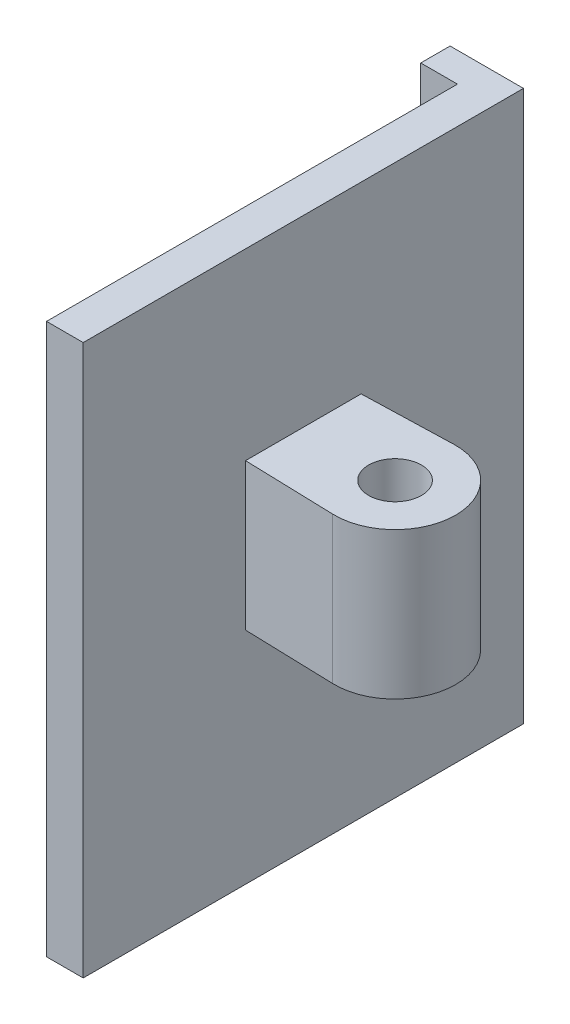
ISO-10303-21;
HEADER;
FILE_DESCRIPTION(('STEP AP214'),'2;1');
FILE_NAME('part.step','',(''),(''),'','','');
FILE_SCHEMA(('AUTOMOTIVE_DESIGN { 1 0 10303 214 1 1 1 1 }'));
ENDSEC;
DATA;
#1=APPLICATION_CONTEXT('core data for automotive mechanical design processes');
#2=APPLICATION_PROTOCOL_DEFINITION('international standard','automotive_design',2000,#1);
#3=PRODUCT_CONTEXT('',#1,'mechanical');
#4=PRODUCT('Part','Part','',(#3));
#5=PRODUCT_RELATED_PRODUCT_CATEGORY('part','',(#4));
#6=PRODUCT_DEFINITION_FORMATION('','',#4);
#7=PRODUCT_DEFINITION_CONTEXT('part definition',#1,'design');
#8=PRODUCT_DEFINITION('design','',#6,#7);
#9=PRODUCT_DEFINITION_SHAPE('','',#8);
#10=(LENGTH_UNIT() NAMED_UNIT(*) SI_UNIT(.MILLI.,.METRE.));
#11=(NAMED_UNIT(*) PLANE_ANGLE_UNIT() SI_UNIT($,.RADIAN.));
#12=(NAMED_UNIT(*) SI_UNIT($,.STERADIAN.) SOLID_ANGLE_UNIT());
#13=UNCERTAINTY_MEASURE_WITH_UNIT(LENGTH_MEASURE(1.E-05),#10,'distance_accuracy_value','');
#14=(GEOMETRIC_REPRESENTATION_CONTEXT(3) GLOBAL_UNCERTAINTY_ASSIGNED_CONTEXT((#13)) GLOBAL_UNIT_ASSIGNED_CONTEXT((#10,
#11,#12)) REPRESENTATION_CONTEXT('',''));
#15=CARTESIAN_POINT('',(0.,0.,0.));
#16=DIRECTION('',(0.,0.,1.));
#17=DIRECTION('',(1.,0.,0.));
#18=AXIS2_PLACEMENT_3D('',#15,#16,#17);
#19=CARTESIAN_POINT('',(2.5,-8.25,0.));
#20=DIRECTION('',(0.,-1.,0.));
#21=DIRECTION('',(0.,0.,-1.));
#22=AXIS2_PLACEMENT_3D('',#19,#20,#21);
#23=CYLINDRICAL_SURFACE('',#22,0.36);
#24=CARTESIAN_POINT('',(2.5,-8.25,0.));
#25=DIRECTION('',(0.,1.,0.));
#26=DIRECTION('',(0.,0.,1.));
#27=AXIS2_PLACEMENT_3D('',#24,#25,#26);
#28=CIRCLE('',#27,0.36);
#29=CARTESIAN_POINT('',(2.5,-8.25,0.360000000000001));
#30=VERTEX_POINT('',#29);
#31=EDGE_CURVE('E184',#30,#30,#28,.T.);
#32=ORIENTED_EDGE('',*,*,#31,.T.);
#33=EDGE_LOOP('',(#32));
#34=FACE_BOUND('',#33,.T.);
#35=CARTESIAN_POINT('',(2.5,-9.65,0.));
#36=DIRECTION('',(0.,-1.,0.));
#37=DIRECTION('',(0.,0.,-1.));
#38=AXIS2_PLACEMENT_3D('',#35,#36,#37);
#39=CIRCLE('',#38,0.36);
#40=CARTESIAN_POINT('',(2.5,-9.65,-0.359999999999999));
#41=VERTEX_POINT('',#40);
#42=EDGE_CURVE('E43',#41,#41,#39,.T.);
#43=ORIENTED_EDGE('',*,*,#42,.T.);
#44=EDGE_LOOP('',(#43));
#45=FACE_BOUND('',#44,.T.);
#46=ADVANCED_FACE('F39',(#34,#45),#23,.F.);
#47=CARTESIAN_POINT('',(0.750000000000001,-8.25,3.));
#48=DIRECTION('',(1.,0.,0.));
#49=DIRECTION('',(0.,0.,-1.));
#50=AXIS2_PLACEMENT_3D('',#47,#48,#49);
#51=PLANE('',#50);
#52=DIRECTION('',(0.,1.,0.));
#53=VECTOR('',#52,1.);
#54=CARTESIAN_POINT('',(0.750000000000001,-5.75,-2.6));
#55=LINE('',#54,#53);
#56=CARTESIAN_POINT('',(0.750000000000001,-13.25,-2.6));
#57=VERTEX_POINT('',#56);
#58=CARTESIAN_POINT('',(0.750000000000001,-5.75,-2.6));
#59=VERTEX_POINT('',#58);
#60=EDGE_CURVE('E55',#57,#59,#55,.T.);
#61=ORIENTED_EDGE('',*,*,#60,.F.);
#62=DIRECTION('',(0.,0.,1.));
#63=VECTOR('',#62,1.);
#64=CARTESIAN_POINT('',(0.750000000000001,-13.25,-3.));
#65=LINE('',#64,#63);
#66=CARTESIAN_POINT('',(0.750000000000001,-13.25,3.));
#67=VERTEX_POINT('',#66);
#68=EDGE_CURVE('E169',#57,#67,#65,.T.);
#69=ORIENTED_EDGE('',*,*,#68,.T.);
#70=DIRECTION('',(0.,-1.,0.));
#71=VECTOR('',#70,1.);
#72=CARTESIAN_POINT('',(0.750000000000001,-8.25,3.));
#73=LINE('',#72,#71);
#74=CARTESIAN_POINT('',(0.750000000000001,-5.75,3.));
#75=VERTEX_POINT('',#74);
#76=EDGE_CURVE('E204',#75,#67,#73,.T.);
#77=ORIENTED_EDGE('',*,*,#76,.F.);
#78=DIRECTION('',(0.,0.,1.));
#79=VECTOR('',#78,1.);
#80=CARTESIAN_POINT('',(0.750000000000001,-5.75,-3.));
#81=LINE('',#80,#79);
#82=EDGE_CURVE('E164',#59,#75,#81,.T.);
#83=ORIENTED_EDGE('',*,*,#82,.F.);
#84=EDGE_LOOP('',(#61,#69,#77,#83));
#85=FACE_BOUND('',#84,.T.);
#86=ADVANCED_FACE('F235',(#85),#51,.F.);
#87=CARTESIAN_POINT('',(2.5,-8.25,0.));
#88=DIRECTION('',(0.,1.,0.));
#89=DIRECTION('',(0.,0.,1.));
#90=AXIS2_PLACEMENT_3D('',#87,#88,#89);
#91=PLANE('',#90);
#92=DIRECTION('',(0.,0.,-1.));
#93=VECTOR('',#92,1.);
#94=CARTESIAN_POINT('',(1.25,-8.25,0.));
#95=LINE('',#94,#93);
#96=CARTESIAN_POINT('',(1.25,-8.25,0.78768744273324));
#97=VERTEX_POINT('',#96);
#98=CARTESIAN_POINT('',(1.25,-8.25,-0.787687442733241));
#99=VERTEX_POINT('',#98);
#100=EDGE_CURVE('E181',#97,#99,#95,.T.);
#101=ORIENTED_EDGE('',*,*,#100,.F.);
#102=DIRECTION('',(0.99954579976556,0.,0.0301362600703332));
#103=VECTOR('',#102,1.);
#104=CARTESIAN_POINT('',(2.47513758544198,-8.25,0.824625284806589));
#105=LINE('',#104,#103);
#106=CARTESIAN_POINT('',(2.47513758544198,-8.25,0.824625284806589));
#107=VERTEX_POINT('',#106);
#108=EDGE_CURVE('E64',#97,#107,#105,.T.);
#109=ORIENTED_EDGE('',*,*,#108,.T.);
#110=CARTESIAN_POINT('',(2.5,-8.25,0.));
#111=DIRECTION('',(0.,1.,0.));
#112=DIRECTION('',(0.,0.,1.));
#113=AXIS2_PLACEMENT_3D('',#110,#111,#112);
#114=CIRCLE('',#113,0.825000000000001);
#115=CARTESIAN_POINT('',(2.47513758544198,-8.25,-0.824625284806588));
#116=VERTEX_POINT('',#115);
#117=EDGE_CURVE('E188',#107,#116,#114,.T.);
#118=ORIENTED_EDGE('',*,*,#117,.T.);
#119=DIRECTION('',(-0.99954579976556,0.,0.0301362600703313));
#120=VECTOR('',#119,1.);
#121=CARTESIAN_POINT('',(1.25,-8.25,-0.787687442733241));
#122=LINE('',#121,#120);
#123=EDGE_CURVE('E86',#116,#99,#122,.T.);
#124=ORIENTED_EDGE('',*,*,#123,.T.);
#125=EDGE_LOOP('',(#101,#109,#118,#124));
#126=FACE_BOUND('',#125,.T.);
#127=ORIENTED_EDGE('',*,*,#31,.F.);
#128=EDGE_LOOP('',(#127));
#129=FACE_BOUND('',#128,.T.);
#130=ADVANCED_FACE('F243',(#126,#129),#91,.T.);
#131=CARTESIAN_POINT('',(2.5,-10.25,0.));
#132=DIRECTION('',(0.,1.,0.));
#133=DIRECTION('',(0.,0.,1.));
#134=AXIS2_PLACEMENT_3D('',#131,#132,#133);
#135=PLANE('',#134);
#136=CARTESIAN_POINT('',(2.5,-10.25,0.));
#137=DIRECTION('',(0.,-1.,0.));
#138=DIRECTION('',(0.,0.,-1.));
#139=AXIS2_PLACEMENT_3D('',#136,#137,#138);
#140=CIRCLE('',#139,0.45);
#141=CARTESIAN_POINT('',(2.5,-10.25,-0.449999999999999));
#142=VERTEX_POINT('',#141);
#143=EDGE_CURVE('E155',#142,#142,#140,.T.);
#144=ORIENTED_EDGE('',*,*,#143,.F.);
#145=EDGE_LOOP('',(#144));
#146=FACE_BOUND('',#145,.T.);
#147=DIRECTION('',(0.99954579976556,0.,0.0301362600703332));
#148=VECTOR('',#147,1.);
#149=CARTESIAN_POINT('',(2.47513758544198,-10.25,0.824625284806589));
#150=LINE('',#149,#148);
#151=CARTESIAN_POINT('',(1.25,-10.25,0.78768744273324));
#152=VERTEX_POINT('',#151);
#153=CARTESIAN_POINT('',(2.47513758544198,-10.25,0.824625284806589));
#154=VERTEX_POINT('',#153);
#155=EDGE_CURVE('E79',#152,#154,#150,.T.);
#156=ORIENTED_EDGE('',*,*,#155,.F.);
#157=DIRECTION('',(0.,0.,-1.));
#158=VECTOR('',#157,1.);
#159=CARTESIAN_POINT('',(1.25,-10.25,0.));
#160=LINE('',#159,#158);
#161=CARTESIAN_POINT('',(1.25,-10.25,-0.787687442733241));
#162=VERTEX_POINT('',#161);
#163=EDGE_CURVE('E179',#152,#162,#160,.T.);
#164=ORIENTED_EDGE('',*,*,#163,.T.);
#165=DIRECTION('',(-0.99954579976556,0.,0.0301362600703313));
#166=VECTOR('',#165,1.);
#167=CARTESIAN_POINT('',(1.25,-10.25,-0.787687442733241));
#168=LINE('',#167,#166);
#169=CARTESIAN_POINT('',(2.47513758544198,-10.25,-0.824625284806588));
#170=VERTEX_POINT('',#169);
#171=EDGE_CURVE('E195',#170,#162,#168,.T.);
#172=ORIENTED_EDGE('',*,*,#171,.F.);
#173=CARTESIAN_POINT('',(2.5,-10.25,0.));
#174=DIRECTION('',(0.,1.,0.));
#175=DIRECTION('',(0.,0.,1.));
#176=AXIS2_PLACEMENT_3D('',#173,#174,#175);
#177=CIRCLE('',#176,0.825000000000001);
#178=EDGE_CURVE('E187',#154,#170,#177,.T.);
#179=ORIENTED_EDGE('',*,*,#178,.F.);
#180=EDGE_LOOP('',(#156,#164,#172,#179));
#181=FACE_BOUND('',#180,.T.);
#182=ADVANCED_FACE('F217',(#146,#181),#135,.F.);
#183=CARTESIAN_POINT('',(2.5,-8.25,0.));
#184=DIRECTION('',(0.,-1.,0.));
#185=DIRECTION('',(0.,0.,-1.));
#186=AXIS2_PLACEMENT_3D('',#183,#184,#185);
#187=CYLINDRICAL_SURFACE('',#186,0.825000000000001);
#188=ORIENTED_EDGE('',*,*,#178,.T.);
#189=DIRECTION('',(0.,-1.,0.));
#190=VECTOR('',#189,1.);
#191=CARTESIAN_POINT('',(2.47513758544198,-8.25,-0.824625284806588));
#192=LINE('',#191,#190);
#193=EDGE_CURVE('E11',#116,#170,#192,.T.);
#194=ORIENTED_EDGE('',*,*,#193,.F.);
#195=ORIENTED_EDGE('',*,*,#117,.F.);
#196=DIRECTION('',(0.,-1.,0.));
#197=VECTOR('',#196,1.);
#198=CARTESIAN_POINT('',(2.47513758544198,-8.25,0.824625284806589));
#199=LINE('',#198,#197);
#200=EDGE_CURVE('E192',#107,#154,#199,.T.);
#201=ORIENTED_EDGE('',*,*,#200,.T.);
#202=EDGE_LOOP('',(#188,#194,#195,#201));
#203=FACE_BOUND('',#202,.T.);
#204=ADVANCED_FACE('F41',(#203),#187,.T.);
#205=CARTESIAN_POINT('',(1.25,-8.25,-0.787687442733241));
#206=DIRECTION('',(0.0301362600703313,0.,0.99954579976556));
#207=DIRECTION('',(0.99954579976556,0.,-0.0301362600703313));
#208=AXIS2_PLACEMENT_3D('',#205,#206,#207);
#209=PLANE('',#208);
#210=ORIENTED_EDGE('',*,*,#171,.T.);
#211=DIRECTION('',(0.,-1.,0.));
#212=VECTOR('',#211,1.);
#213=CARTESIAN_POINT('',(1.25,-8.25,-0.787687442733241));
#214=LINE('',#213,#212);
#215=EDGE_CURVE('E48',#99,#162,#214,.T.);
#216=ORIENTED_EDGE('',*,*,#215,.F.);
#217=ORIENTED_EDGE('',*,*,#123,.F.);
#218=ORIENTED_EDGE('',*,*,#193,.T.);
#219=EDGE_LOOP('',(#210,#216,#217,#218));
#220=FACE_BOUND('',#219,.T.);
#221=ADVANCED_FACE('F213',(#220),#209,.F.);
#222=CARTESIAN_POINT('',(0.750000000000001,-8.25,-3.));
#223=DIRECTION('',(0.,0.,1.));
#224=DIRECTION('',(1.,0.,0.));
#225=AXIS2_PLACEMENT_3D('',#222,#223,#224);
#226=PLANE('',#225);
#227=DIRECTION('',(0.,-1.,0.));
#228=VECTOR('',#227,1.);
#229=CARTESIAN_POINT('',(1.25,-8.25,-3.));
#230=LINE('',#229,#228);
#231=CARTESIAN_POINT('',(1.25,-5.75,-3.));
#232=VERTEX_POINT('',#231);
#233=CARTESIAN_POINT('',(1.25,-13.25,-3.));
#234=VERTEX_POINT('',#233);
#235=EDGE_CURVE('E132',#232,#234,#230,.T.);
#236=ORIENTED_EDGE('',*,*,#235,.T.);
#237=DIRECTION('',(-1.,0.,0.));
#238=VECTOR('',#237,1.);
#239=CARTESIAN_POINT('',(1.25,-13.25,-3.));
#240=LINE('',#239,#238);
#241=CARTESIAN_POINT('',(0.250000000000001,-13.25,-3.));
#242=VERTEX_POINT('',#241);
#243=EDGE_CURVE('E126',#234,#242,#240,.T.);
#244=ORIENTED_EDGE('',*,*,#243,.T.);
#245=DIRECTION('',(0.,-1.,0.));
#246=VECTOR('',#245,1.);
#247=CARTESIAN_POINT('',(0.250000000000001,-5.75,-3.));
#248=LINE('',#247,#246);
#249=CARTESIAN_POINT('',(0.250000000000001,-5.75,-3.));
#250=VERTEX_POINT('',#249);
#251=EDGE_CURVE('E131',#250,#242,#248,.T.);
#252=ORIENTED_EDGE('',*,*,#251,.F.);
#253=DIRECTION('',(-1.,0.,0.));
#254=VECTOR('',#253,1.);
#255=CARTESIAN_POINT('',(1.25,-5.75,-3.));
#256=LINE('',#255,#254);
#257=EDGE_CURVE('E137',#232,#250,#256,.T.);
#258=ORIENTED_EDGE('',*,*,#257,.F.);
#259=EDGE_LOOP('',(#236,#244,#252,#258));
#260=FACE_BOUND('',#259,.T.);
#261=ADVANCED_FACE('F128',(#260),#226,.F.);
#262=CARTESIAN_POINT('',(1.25,-8.25,3.));
#263=DIRECTION('',(0.,0.,-1.));
#264=DIRECTION('',(-1.,0.,0.));
#265=AXIS2_PLACEMENT_3D('',#262,#263,#264);
#266=PLANE('',#265);
#267=ORIENTED_EDGE('',*,*,#76,.T.);
#268=DIRECTION('',(-1.,0.,0.));
#269=VECTOR('',#268,1.);
#270=CARTESIAN_POINT('',(1.25,-13.25,3.));
#271=LINE('',#270,#269);
#272=CARTESIAN_POINT('',(1.25,-13.25,3.));
#273=VERTEX_POINT('',#272);
#274=EDGE_CURVE('E136',#273,#67,#271,.T.);
#275=ORIENTED_EDGE('',*,*,#274,.F.);
#276=DIRECTION('',(0.,-1.,0.));
#277=VECTOR('',#276,1.);
#278=CARTESIAN_POINT('',(1.25,-8.25,3.));
#279=LINE('',#278,#277);
#280=CARTESIAN_POINT('',(1.25,-5.75,3.));
#281=VERTEX_POINT('',#280);
#282=EDGE_CURVE('E202',#281,#273,#279,.T.);
#283=ORIENTED_EDGE('',*,*,#282,.F.);
#284=DIRECTION('',(-1.,0.,0.));
#285=VECTOR('',#284,1.);
#286=CARTESIAN_POINT('',(1.25,-5.75,3.));
#287=LINE('',#286,#285);
#288=EDGE_CURVE('E176',#281,#75,#287,.T.);
#289=ORIENTED_EDGE('',*,*,#288,.T.);
#290=EDGE_LOOP('',(#267,#275,#283,#289));
#291=FACE_BOUND('',#290,.T.);
#292=ADVANCED_FACE('F231',(#291),#266,.F.);
#293=CARTESIAN_POINT('',(1.25,-8.25,0.78768744273324));
#294=DIRECTION('',(-1.,0.,0.));
#295=DIRECTION('',(0.,0.,1.));
#296=AXIS2_PLACEMENT_3D('',#293,#294,#295);
#297=PLANE('',#296);
#298=DIRECTION('',(0.,-1.,0.));
#299=VECTOR('',#298,1.);
#300=CARTESIAN_POINT('',(1.25,-8.25,0.78768744273324));
#301=LINE('',#300,#299);
#302=EDGE_CURVE('E200',#97,#152,#301,.T.);
#303=ORIENTED_EDGE('',*,*,#302,.F.);
#304=ORIENTED_EDGE('',*,*,#100,.T.);
#305=ORIENTED_EDGE('',*,*,#215,.T.);
#306=ORIENTED_EDGE('',*,*,#163,.F.);
#307=EDGE_LOOP('',(#303,#304,#305,#306));
#308=FACE_BOUND('',#307,.T.);
#309=ORIENTED_EDGE('',*,*,#282,.T.);
#310=DIRECTION('',(0.,0.,1.));
#311=VECTOR('',#310,1.);
#312=CARTESIAN_POINT('',(1.25,-13.25,-3.));
#313=LINE('',#312,#311);
#314=EDGE_CURVE('E168',#234,#273,#313,.T.);
#315=ORIENTED_EDGE('',*,*,#314,.F.);
#316=ORIENTED_EDGE('',*,*,#235,.F.);
#317=DIRECTION('',(0.,0.,1.));
#318=VECTOR('',#317,1.);
#319=CARTESIAN_POINT('',(1.25,-5.75,-3.));
#320=LINE('',#319,#318);
#321=EDGE_CURVE('E165',#232,#281,#320,.T.);
#322=ORIENTED_EDGE('',*,*,#321,.T.);
#323=EDGE_LOOP('',(#309,#315,#316,#322));
#324=FACE_BOUND('',#323,.T.);
#325=ADVANCED_FACE('F211',(#308,#324),#297,.F.);
#326=CARTESIAN_POINT('',(2.47513758544198,-8.25,0.824625284806589));
#327=DIRECTION('',(0.0301362600703332,0.,-0.99954579976556));
#328=DIRECTION('',(-0.99954579976556,0.,-0.0301362600703332));
#329=AXIS2_PLACEMENT_3D('',#326,#327,#328);
#330=PLANE('',#329);
#331=ORIENTED_EDGE('',*,*,#155,.T.);
#332=ORIENTED_EDGE('',*,*,#200,.F.);
#333=ORIENTED_EDGE('',*,*,#108,.F.);
#334=ORIENTED_EDGE('',*,*,#302,.T.);
#335=EDGE_LOOP('',(#331,#332,#333,#334));
#336=FACE_BOUND('',#335,.T.);
#337=ADVANCED_FACE('F220',(#336),#330,.F.);
#338=CARTESIAN_POINT('',(1.25,-13.25,-3.));
#339=DIRECTION('',(0.,-1.,0.));
#340=DIRECTION('',(1.,0.,0.));
#341=AXIS2_PLACEMENT_3D('',#338,#339,#340);
#342=PLANE('',#341);
#343=ORIENTED_EDGE('',*,*,#68,.F.);
#344=DIRECTION('',(1.,0.,0.));
#345=VECTOR('',#344,1.);
#346=CARTESIAN_POINT('',(0.250000000000001,-13.25,-2.6));
#347=LINE('',#346,#345);
#348=CARTESIAN_POINT('',(0.250000000000001,-13.25,-2.6));
#349=VERTEX_POINT('',#348);
#350=EDGE_CURVE('E143',#349,#57,#347,.T.);
#351=ORIENTED_EDGE('',*,*,#350,.F.);
#352=DIRECTION('',(0.,0.,1.));
#353=VECTOR('',#352,1.);
#354=CARTESIAN_POINT('',(0.250000000000001,-13.25,-3.));
#355=LINE('',#354,#353);
#356=EDGE_CURVE('E140',#242,#349,#355,.T.);
#357=ORIENTED_EDGE('',*,*,#356,.F.);
#358=ORIENTED_EDGE('',*,*,#243,.F.);
#359=ORIENTED_EDGE('',*,*,#314,.T.);
#360=ORIENTED_EDGE('',*,*,#274,.T.);
#361=EDGE_LOOP('',(#343,#351,#357,#358,#359,#360));
#362=FACE_BOUND('',#361,.T.);
#363=ADVANCED_FACE('F141',(#362),#342,.T.);
#364=CARTESIAN_POINT('',(1.25,-5.75,-3.));
#365=DIRECTION('',(0.,-1.,0.));
#366=DIRECTION('',(1.,0.,0.));
#367=AXIS2_PLACEMENT_3D('',#364,#365,#366);
#368=PLANE('',#367);
#369=ORIENTED_EDGE('',*,*,#257,.T.);
#370=DIRECTION('',(0.,0.,-1.));
#371=VECTOR('',#370,1.);
#372=CARTESIAN_POINT('',(0.250000000000001,-5.75,-3.));
#373=LINE('',#372,#371);
#374=CARTESIAN_POINT('',(0.250000000000001,-5.75,-2.6));
#375=VERTEX_POINT('',#374);
#376=EDGE_CURVE('E151',#375,#250,#373,.T.);
#377=ORIENTED_EDGE('',*,*,#376,.F.);
#378=DIRECTION('',(1.,0.,0.));
#379=VECTOR('',#378,1.);
#380=CARTESIAN_POINT('',(0.250000000000001,-5.75,-2.6));
#381=LINE('',#380,#379);
#382=EDGE_CURVE('E159',#375,#59,#381,.T.);
#383=ORIENTED_EDGE('',*,*,#382,.T.);
#384=ORIENTED_EDGE('',*,*,#82,.T.);
#385=ORIENTED_EDGE('',*,*,#288,.F.);
#386=ORIENTED_EDGE('',*,*,#321,.F.);
#387=EDGE_LOOP('',(#369,#377,#383,#384,#385,#386));
#388=FACE_BOUND('',#387,.T.);
#389=ADVANCED_FACE('F229',(#388),#368,.F.);
#390=CARTESIAN_POINT('',(0.250000000000001,-5.75,-2.6));
#391=DIRECTION('',(0.,0.,-1.));
#392=DIRECTION('',(0.,1.,0.));
#393=AXIS2_PLACEMENT_3D('',#390,#391,#392);
#394=PLANE('',#393);
#395=ORIENTED_EDGE('',*,*,#60,.T.);
#396=ORIENTED_EDGE('',*,*,#382,.F.);
#397=DIRECTION('',(0.,1.,0.));
#398=VECTOR('',#397,1.);
#399=CARTESIAN_POINT('',(0.250000000000001,-5.75,-2.6));
#400=LINE('',#399,#398);
#401=EDGE_CURVE('E146',#349,#375,#400,.T.);
#402=ORIENTED_EDGE('',*,*,#401,.F.);
#403=ORIENTED_EDGE('',*,*,#350,.T.);
#404=EDGE_LOOP('',(#395,#396,#402,#403));
#405=FACE_BOUND('',#404,.T.);
#406=ADVANCED_FACE('F278',(#405),#394,.F.);
#407=CARTESIAN_POINT('',(0.250000000000001,0.,0.));
#408=DIRECTION('',(-1.,0.,0.));
#409=DIRECTION('',(0.,0.,1.));
#410=AXIS2_PLACEMENT_3D('',#407,#408,#409);
#411=PLANE('',#410);
#412=ORIENTED_EDGE('',*,*,#251,.T.);
#413=ORIENTED_EDGE('',*,*,#356,.T.);
#414=ORIENTED_EDGE('',*,*,#401,.T.);
#415=ORIENTED_EDGE('',*,*,#376,.T.);
#416=EDGE_LOOP('',(#412,#413,#414,#415));
#417=FACE_BOUND('',#416,.T.);
#418=ADVANCED_FACE('F149',(#417),#411,.T.);
#419=CARTESIAN_POINT('',(2.5,-9.65,0.));
#420=DIRECTION('',(0.,-1.,0.));
#421=DIRECTION('',(0.,0.,-1.));
#422=AXIS2_PLACEMENT_3D('',#419,#420,#421);
#423=CYLINDRICAL_SURFACE('',#422,0.45);
#424=CARTESIAN_POINT('',(2.5,-9.65,0.));
#425=DIRECTION('',(0.,-1.,0.));
#426=DIRECTION('',(0.,0.,-1.));
#427=AXIS2_PLACEMENT_3D('',#424,#425,#426);
#428=CIRCLE('',#427,0.45);
#429=CARTESIAN_POINT('',(2.5,-9.65,-0.449999999999999));
#430=VERTEX_POINT('',#429);
#431=EDGE_CURVE('E258',#430,#430,#428,.T.);
#432=ORIENTED_EDGE('',*,*,#431,.F.);
#433=EDGE_LOOP('',(#432));
#434=FACE_BOUND('',#433,.T.);
#435=ORIENTED_EDGE('',*,*,#143,.T.);
#436=EDGE_LOOP('',(#435));
#437=FACE_BOUND('',#436,.T.);
#438=ADVANCED_FACE('F267',(#434,#437),#423,.F.);
#439=CARTESIAN_POINT('',(2.5,-9.65,0.));
#440=DIRECTION('',(0.,-1.,0.));
#441=DIRECTION('',(0.,0.,-1.));
#442=AXIS2_PLACEMENT_3D('',#439,#440,#441);
#443=PLANE('',#442);
#444=ORIENTED_EDGE('',*,*,#42,.F.);
#445=EDGE_LOOP('',(#444));
#446=FACE_BOUND('',#445,.T.);
#447=ORIENTED_EDGE('',*,*,#431,.T.);
#448=EDGE_LOOP('',(#447));
#449=FACE_BOUND('',#448,.T.);
#450=ADVANCED_FACE('F265',(#446,#449),#443,.T.);
#451=CLOSED_SHELL('',(#46,#86,#130,#182,#204,#221,#261,#292,#325,#337,#363,#389,#406,#418,#438,#450));
#452=MANIFOLD_SOLID_BREP('B2',#451);
#453=ADVANCED_BREP_SHAPE_REPRESENTATION('',(#18,#452),#14);
#454=SHAPE_DEFINITION_REPRESENTATION(#9,#453);
ENDSEC;
END-ISO-10303-21;
